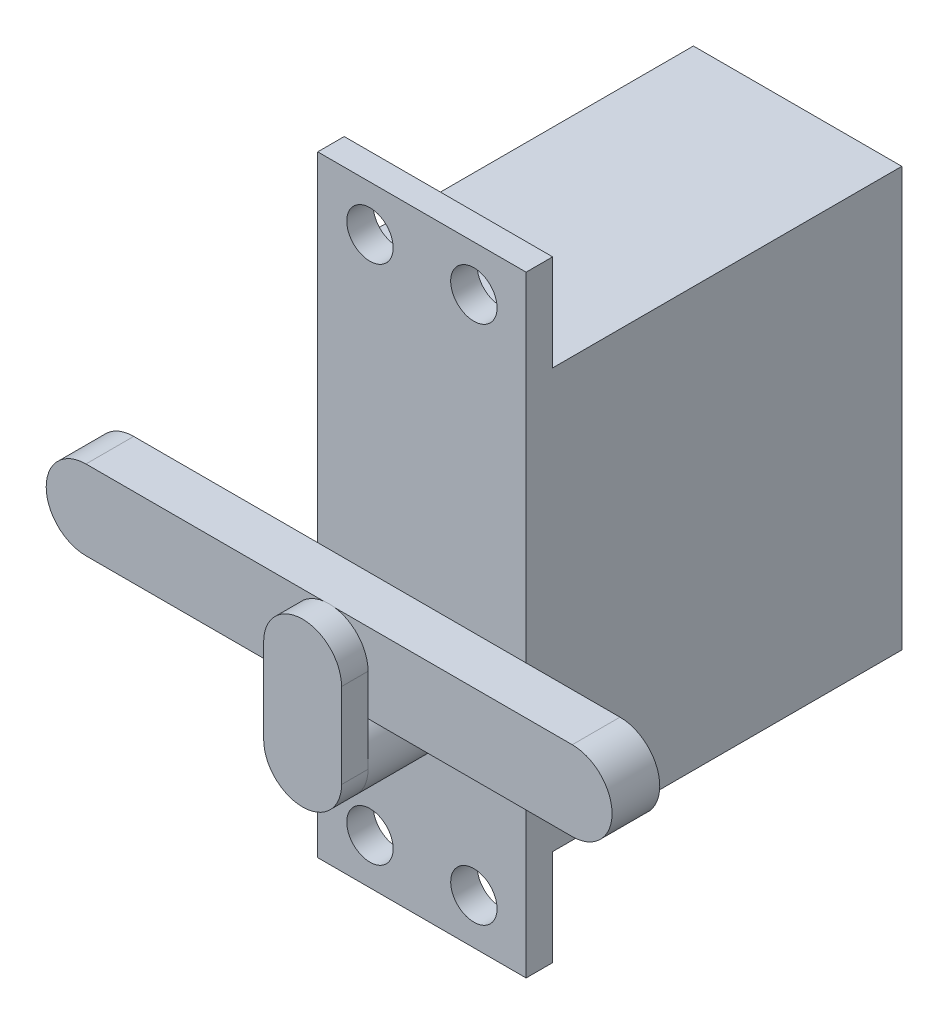
ISO-10303-21;
HEADER;
FILE_DESCRIPTION(('STEP AP214'),'2;1');
FILE_NAME('part.step','',(''),(''),'','','');
FILE_SCHEMA(('AUTOMOTIVE_DESIGN { 1 0 10303 214 1 1 1 1 }'));
ENDSEC;
DATA;
#1=APPLICATION_CONTEXT('core data for automotive mechanical design processes');
#2=APPLICATION_PROTOCOL_DEFINITION('international standard','automotive_design',2000,#1);
#3=PRODUCT_CONTEXT('',#1,'mechanical');
#4=PRODUCT('Part','Part','',(#3));
#5=PRODUCT_RELATED_PRODUCT_CATEGORY('part','',(#4));
#6=PRODUCT_DEFINITION_FORMATION('','',#4);
#7=PRODUCT_DEFINITION_CONTEXT('part definition',#1,'design');
#8=PRODUCT_DEFINITION('design','',#6,#7);
#9=PRODUCT_DEFINITION_SHAPE('','',#8);
#10=(LENGTH_UNIT() NAMED_UNIT(*) SI_UNIT(.MILLI.,.METRE.));
#11=(NAMED_UNIT(*) PLANE_ANGLE_UNIT() SI_UNIT($,.RADIAN.));
#12=(NAMED_UNIT(*) SI_UNIT($,.STERADIAN.) SOLID_ANGLE_UNIT());
#13=UNCERTAINTY_MEASURE_WITH_UNIT(LENGTH_MEASURE(1.E-05),#10,'distance_accuracy_value','');
#14=(GEOMETRIC_REPRESENTATION_CONTEXT(3) GLOBAL_UNCERTAINTY_ASSIGNED_CONTEXT((#13)) GLOBAL_UNIT_ASSIGNED_CONTEXT((#10,
#11,#12)) REPRESENTATION_CONTEXT('',''));
#15=CARTESIAN_POINT('',(0.,0.,0.));
#16=DIRECTION('',(0.,0.,1.));
#17=DIRECTION('',(1.,0.,0.));
#18=AXIS2_PLACEMENT_3D('',#15,#16,#17);
#19=CARTESIAN_POINT('',(0.,14.4241287550858,66.3463432179268));
#20=DIRECTION('',(0.,0.,-1.));
#21=DIRECTION('',(-1.,0.,0.));
#22=AXIS2_PLACEMENT_3D('',#19,#20,#21);
#23=CYLINDRICAL_SURFACE('',#22,3.73047673079755);
#24=CARTESIAN_POINT('',(0.,14.4241287550858,63.8063432179268));
#25=DIRECTION('',(0.,0.,1.));
#26=DIRECTION('',(1.,0.,0.));
#27=AXIS2_PLACEMENT_3D('',#24,#25,#26);
#28=CIRCLE('',#27,3.73047673079755);
#29=CARTESIAN_POINT('',(3.73047673079755,14.4241287550858,63.8063432179268));
#30=VERTEX_POINT('',#29);
#31=CARTESIAN_POINT('',(-3.73047673079755,14.4241287550858,63.8063432179268));
#32=VERTEX_POINT('',#31);
#33=EDGE_CURVE('E108',#30,#32,#28,.T.);
#34=ORIENTED_EDGE('',*,*,#33,.T.);
#35=DIRECTION('',(0.,0.,-1.));
#36=VECTOR('',#35,1.);
#37=CARTESIAN_POINT('',(-3.73047673079755,14.4241287550858,66.3463432179268));
#38=LINE('',#37,#36);
#39=CARTESIAN_POINT('',(-3.73047673079755,14.4241287550858,66.3463432179268));
#40=VERTEX_POINT('',#39);
#41=EDGE_CURVE('E12',#40,#32,#38,.T.);
#42=ORIENTED_EDGE('',*,*,#41,.F.);
#43=CARTESIAN_POINT('',(0.,14.4241287550858,66.3463432179268));
#44=DIRECTION('',(0.,0.,1.));
#45=DIRECTION('',(1.,0.,0.));
#46=AXIS2_PLACEMENT_3D('',#43,#44,#45);
#47=CIRCLE('',#46,3.73047673079755);
#48=CARTESIAN_POINT('',(3.73047673079755,14.4241287550858,66.3463432179268));
#49=VERTEX_POINT('',#48);
#50=EDGE_CURVE('E96',#49,#40,#47,.T.);
#51=ORIENTED_EDGE('',*,*,#50,.F.);
#52=DIRECTION('',(0.,0.,-1.));
#53=VECTOR('',#52,1.);
#54=CARTESIAN_POINT('',(3.73047673079755,14.4241287550858,66.3463432179268));
#55=LINE('',#54,#53);
#56=EDGE_CURVE('E104',#49,#30,#55,.T.);
#57=ORIENTED_EDGE('',*,*,#56,.T.);
#58=EDGE_LOOP('',(#34,#42,#51,#57));
#59=FACE_BOUND('',#58,.T.);
#60=ADVANCED_FACE('F45',(#59),#23,.T.);
#61=CARTESIAN_POINT('',(-3.73047673079755,14.4241287550858,66.3463432179268));
#62=DIRECTION('',(1.,0.,0.));
#63=DIRECTION('',(0.,1.,0.));
#64=AXIS2_PLACEMENT_3D('',#61,#62,#63);
#65=PLANE('',#64);
#66=DIRECTION('',(0.,-1.,0.));
#67=VECTOR('',#66,1.);
#68=CARTESIAN_POINT('',(-3.73047673079755,14.4241287550858,63.8063432179268));
#69=LINE('',#68,#67);
#70=CARTESIAN_POINT('',(-3.73047673079754,6.29368329163792,63.8063432179268));
#71=VERTEX_POINT('',#70);
#72=EDGE_CURVE('E100',#32,#71,#69,.T.);
#73=ORIENTED_EDGE('',*,*,#72,.T.);
#74=DIRECTION('',(0.,0.,-1.));
#75=VECTOR('',#74,1.);
#76=CARTESIAN_POINT('',(-3.73047673079754,6.29368329163792,66.3463432179268));
#77=LINE('',#76,#75);
#78=CARTESIAN_POINT('',(-3.73047673079754,6.29368329163792,66.3463432179268));
#79=VERTEX_POINT('',#78);
#80=EDGE_CURVE('E53',#79,#71,#77,.T.);
#81=ORIENTED_EDGE('',*,*,#80,.F.);
#82=DIRECTION('',(0.,-1.,0.));
#83=VECTOR('',#82,1.);
#84=CARTESIAN_POINT('',(-3.73047673079755,14.4241287550858,66.3463432179268));
#85=LINE('',#84,#83);
#86=EDGE_CURVE('E91',#40,#79,#85,.T.);
#87=ORIENTED_EDGE('',*,*,#86,.F.);
#88=ORIENTED_EDGE('',*,*,#41,.T.);
#89=EDGE_LOOP('',(#73,#81,#87,#88));
#90=FACE_BOUND('',#89,.T.);
#91=ADVANCED_FACE('F99',(#90),#65,.F.);
#92=CARTESIAN_POINT('',(0.,6.29368329163793,66.3463432179268));
#93=DIRECTION('',(0.,0.,-1.));
#94=DIRECTION('',(-1.,0.,0.));
#95=AXIS2_PLACEMENT_3D('',#92,#93,#94);
#96=CYLINDRICAL_SURFACE('',#95,3.73047673079754);
#97=CARTESIAN_POINT('',(0.,6.29368329163793,63.8063432179268));
#98=DIRECTION('',(0.,0.,1.));
#99=DIRECTION('',(1.,0.,0.));
#100=AXIS2_PLACEMENT_3D('',#97,#98,#99);
#101=CIRCLE('',#100,3.73047673079754);
#102=CARTESIAN_POINT('',(3.73047673079755,6.29368329163793,63.8063432179268));
#103=VERTEX_POINT('',#102);
#104=EDGE_CURVE('E78',#71,#103,#101,.T.);
#105=ORIENTED_EDGE('',*,*,#104,.T.);
#106=DIRECTION('',(0.,0.,-1.));
#107=VECTOR('',#106,1.);
#108=CARTESIAN_POINT('',(3.73047673079755,6.29368329163793,66.3463432179268));
#109=LINE('',#108,#107);
#110=CARTESIAN_POINT('',(3.73047673079755,6.29368329163793,66.3463432179268));
#111=VERTEX_POINT('',#110);
#112=EDGE_CURVE('E101',#111,#103,#109,.T.);
#113=ORIENTED_EDGE('',*,*,#112,.F.);
#114=CARTESIAN_POINT('',(0.,6.29368329163793,66.3463432179268));
#115=DIRECTION('',(0.,0.,1.));
#116=DIRECTION('',(1.,0.,0.));
#117=AXIS2_PLACEMENT_3D('',#114,#115,#116);
#118=CIRCLE('',#117,3.73047673079754);
#119=EDGE_CURVE('E94',#79,#111,#118,.T.);
#120=ORIENTED_EDGE('',*,*,#119,.F.);
#121=ORIENTED_EDGE('',*,*,#80,.T.);
#122=EDGE_LOOP('',(#105,#113,#120,#121));
#123=FACE_BOUND('',#122,.T.);
#124=ADVANCED_FACE('F102',(#123),#96,.T.);
#125=CARTESIAN_POINT('',(3.73047673079755,14.4241287550858,66.3463432179268));
#126=DIRECTION('',(-1.,0.,0.));
#127=DIRECTION('',(0.,-1.,0.));
#128=AXIS2_PLACEMENT_3D('',#125,#126,#127);
#129=PLANE('',#128);
#130=DIRECTION('',(0.,1.,0.));
#131=VECTOR('',#130,1.);
#132=CARTESIAN_POINT('',(3.73047673079755,14.4241287550858,63.8063432179268));
#133=LINE('',#132,#131);
#134=EDGE_CURVE('E84',#103,#30,#133,.T.);
#135=ORIENTED_EDGE('',*,*,#134,.T.);
#136=ORIENTED_EDGE('',*,*,#56,.F.);
#137=DIRECTION('',(0.,1.,0.));
#138=VECTOR('',#137,1.);
#139=CARTESIAN_POINT('',(3.73047673079755,14.4241287550858,66.3463432179268));
#140=LINE('',#139,#138);
#141=EDGE_CURVE('E61',#111,#49,#140,.T.);
#142=ORIENTED_EDGE('',*,*,#141,.F.);
#143=ORIENTED_EDGE('',*,*,#112,.T.);
#144=EDGE_LOOP('',(#135,#136,#142,#143));
#145=FACE_BOUND('',#144,.T.);
#146=ADVANCED_FACE('F115',(#145),#129,.F.);
#147=CARTESIAN_POINT('',(0.,14.4241287550858,66.3463432179268));
#148=DIRECTION('',(0.,0.,1.));
#149=DIRECTION('',(1.,0.,0.));
#150=AXIS2_PLACEMENT_3D('',#147,#148,#149);
#151=PLANE('',#150);
#152=ORIENTED_EDGE('',*,*,#50,.T.);
#153=ORIENTED_EDGE('',*,*,#86,.T.);
#154=ORIENTED_EDGE('',*,*,#119,.T.);
#155=ORIENTED_EDGE('',*,*,#141,.T.);
#156=EDGE_LOOP('',(#152,#153,#154,#155));
#157=FACE_BOUND('',#156,.T.);
#158=ADVANCED_FACE('F92',(#157),#151,.T.);
#159=CARTESIAN_POINT('',(0.,14.4241287550858,63.8063432179268));
#160=DIRECTION('',(0.,0.,1.));
#161=DIRECTION('',(1.,0.,0.));
#162=AXIS2_PLACEMENT_3D('',#159,#160,#161);
#163=PLANE('',#162);
#164=ORIENTED_EDGE('',*,*,#33,.F.);
#165=ORIENTED_EDGE('',*,*,#134,.F.);
#166=ORIENTED_EDGE('',*,*,#104,.F.);
#167=ORIENTED_EDGE('',*,*,#72,.F.);
#168=EDGE_LOOP('',(#164,#165,#166,#167));
#169=FACE_BOUND('',#168,.T.);
#170=ADVANCED_FACE('F118',(#169),#163,.F.);
#171=CLOSED_SHELL('',(#60,#91,#124,#146,#158,#170));
#172=MANIFOLD_SOLID_BREP('B2',#171);
#173=CARTESIAN_POINT('',(23.2931343343188,14.2993852114119,59.2343432179268));
#174=DIRECTION('',(0.,0.,1.));
#175=DIRECTION('',(1.,0.,0.));
#176=AXIS2_PLACEMENT_3D('',#173,#174,#175);
#177=CYLINDRICAL_SURFACE('',#176,3.81139952589896);
#178=CARTESIAN_POINT('',(23.2931343343188,14.2993852114119,63.8063432179268));
#179=DIRECTION('',(0.,0.,1.));
#180=DIRECTION('',(1.,0.,0.));
#181=AXIS2_PLACEMENT_3D('',#178,#179,#180);
#182=CIRCLE('',#181,3.81139952589896);
#183=CARTESIAN_POINT('',(23.2931343343188,10.4879856855129,63.8063432179268));
#184=VERTEX_POINT('',#183);
#185=CARTESIAN_POINT('',(23.2931343343188,18.1107847373108,63.8063432179268));
#186=VERTEX_POINT('',#185);
#187=EDGE_CURVE('E241',#184,#186,#182,.T.);
#188=ORIENTED_EDGE('',*,*,#187,.F.);
#189=DIRECTION('',(0.,0.,1.));
#190=VECTOR('',#189,1.);
#191=CARTESIAN_POINT('',(23.2931343343188,10.4879856855129,59.2343432179268));
#192=LINE('',#191,#190);
#193=CARTESIAN_POINT('',(23.2931343343188,10.4879856855129,59.2343432179268));
#194=VERTEX_POINT('',#193);
#195=EDGE_CURVE('E43',#194,#184,#192,.T.);
#196=ORIENTED_EDGE('',*,*,#195,.F.);
#197=CARTESIAN_POINT('',(23.2931343343188,14.2993852114119,59.2343432179268));
#198=DIRECTION('',(0.,0.,1.));
#199=DIRECTION('',(1.,0.,0.));
#200=AXIS2_PLACEMENT_3D('',#197,#198,#199);
#201=CIRCLE('',#200,3.81139952589896);
#202=CARTESIAN_POINT('',(23.2931343343188,18.1107847373108,59.2343432179268));
#203=VERTEX_POINT('',#202);
#204=EDGE_CURVE('E235',#194,#203,#201,.T.);
#205=ORIENTED_EDGE('',*,*,#204,.T.);
#206=DIRECTION('',(0.,0.,1.));
#207=VECTOR('',#206,1.);
#208=CARTESIAN_POINT('',(23.2931343343188,18.1107847373108,59.2343432179268));
#209=LINE('',#208,#207);
#210=EDGE_CURVE('E180',#203,#186,#209,.T.);
#211=ORIENTED_EDGE('',*,*,#210,.T.);
#212=EDGE_LOOP('',(#188,#196,#205,#211));
#213=FACE_BOUND('',#212,.T.);
#214=ADVANCED_FACE('F177',(#213),#177,.T.);
#215=CARTESIAN_POINT('',(23.2931343343188,10.4879856855129,59.2343432179268));
#216=DIRECTION('',(0.,-1.,0.));
#217=DIRECTION('',(0.,0.,-1.));
#218=AXIS2_PLACEMENT_3D('',#215,#216,#217);
#219=PLANE('',#218);
#220=DIRECTION('',(1.,0.,0.));
#221=VECTOR('',#220,1.);
#222=CARTESIAN_POINT('',(23.2931343343188,10.4879856855129,63.8063432179268));
#223=LINE('',#222,#221);
#224=CARTESIAN_POINT('',(-23.2931343343188,10.4879856855129,63.8063432179268));
#225=VERTEX_POINT('',#224);
#226=EDGE_CURVE('E237',#225,#184,#223,.T.);
#227=ORIENTED_EDGE('',*,*,#226,.F.);
#228=DIRECTION('',(0.,0.,1.));
#229=VECTOR('',#228,1.);
#230=CARTESIAN_POINT('',(-23.2931343343188,10.4879856855129,59.2343432179268));
#231=LINE('',#230,#229);
#232=CARTESIAN_POINT('',(-23.2931343343188,10.4879856855129,59.2343432179268));
#233=VERTEX_POINT('',#232);
#234=EDGE_CURVE('E186',#233,#225,#231,.T.);
#235=ORIENTED_EDGE('',*,*,#234,.F.);
#236=DIRECTION('',(1.,0.,0.));
#237=VECTOR('',#236,1.);
#238=CARTESIAN_POINT('',(23.2931343343188,10.4879856855129,59.2343432179268));
#239=LINE('',#238,#237);
#240=EDGE_CURVE('E232',#233,#194,#239,.T.);
#241=ORIENTED_EDGE('',*,*,#240,.T.);
#242=ORIENTED_EDGE('',*,*,#195,.T.);
#243=EDGE_LOOP('',(#227,#235,#241,#242));
#244=FACE_BOUND('',#243,.T.);
#245=ADVANCED_FACE('F251',(#244),#219,.T.);
#246=CARTESIAN_POINT('',(-23.2931343343188,14.2993852114119,59.2343432179268));
#247=DIRECTION('',(0.,0.,1.));
#248=DIRECTION('',(1.,0.,0.));
#249=AXIS2_PLACEMENT_3D('',#246,#247,#248);
#250=CYLINDRICAL_SURFACE('',#249,3.81139952589896);
#251=CARTESIAN_POINT('',(-23.2931343343188,14.2993852114119,63.8063432179268));
#252=DIRECTION('',(0.,0.,1.));
#253=DIRECTION('',(-1.,0.,0.));
#254=AXIS2_PLACEMENT_3D('',#251,#252,#253);
#255=CIRCLE('',#254,3.81139952589896);
#256=CARTESIAN_POINT('',(-23.2931343343188,18.1107847373108,63.8063432179268));
#257=VERTEX_POINT('',#256);
#258=EDGE_CURVE('E227',#257,#225,#255,.T.);
#259=ORIENTED_EDGE('',*,*,#258,.F.);
#260=DIRECTION('',(0.,0.,1.));
#261=VECTOR('',#260,1.);
#262=CARTESIAN_POINT('',(-23.2931343343188,18.1107847373108,59.2343432179268));
#263=LINE('',#262,#261);
#264=CARTESIAN_POINT('',(-23.2931343343188,18.1107847373108,59.2343432179268));
#265=VERTEX_POINT('',#264);
#266=EDGE_CURVE('E222',#265,#257,#263,.T.);
#267=ORIENTED_EDGE('',*,*,#266,.F.);
#268=CARTESIAN_POINT('',(-23.2931343343188,14.2993852114119,59.2343432179268));
#269=DIRECTION('',(0.,0.,1.));
#270=DIRECTION('',(-1.,0.,0.));
#271=AXIS2_PLACEMENT_3D('',#268,#269,#270);
#272=CIRCLE('',#271,3.81139952589896);
#273=EDGE_CURVE('E225',#265,#233,#272,.T.);
#274=ORIENTED_EDGE('',*,*,#273,.T.);
#275=ORIENTED_EDGE('',*,*,#234,.T.);
#276=EDGE_LOOP('',(#259,#267,#274,#275));
#277=FACE_BOUND('',#276,.T.);
#278=ADVANCED_FACE('F224',(#277),#250,.T.);
#279=CARTESIAN_POINT('',(23.2931343343188,18.1107847373108,59.2343432179268));
#280=DIRECTION('',(0.,1.,0.));
#281=DIRECTION('',(-1.,0.,0.));
#282=AXIS2_PLACEMENT_3D('',#279,#280,#281);
#283=PLANE('',#282);
#284=DIRECTION('',(-1.,0.,0.));
#285=VECTOR('',#284,1.);
#286=CARTESIAN_POINT('',(23.2931343343188,18.1107847373108,63.8063432179268));
#287=LINE('',#286,#285);
#288=EDGE_CURVE('E244',#186,#257,#287,.T.);
#289=ORIENTED_EDGE('',*,*,#288,.F.);
#290=ORIENTED_EDGE('',*,*,#210,.F.);
#291=DIRECTION('',(-1.,0.,0.));
#292=VECTOR('',#291,1.);
#293=CARTESIAN_POINT('',(23.2931343343188,18.1107847373108,59.2343432179268));
#294=LINE('',#293,#292);
#295=EDGE_CURVE('E231',#203,#265,#294,.T.);
#296=ORIENTED_EDGE('',*,*,#295,.T.);
#297=ORIENTED_EDGE('',*,*,#266,.T.);
#298=EDGE_LOOP('',(#289,#290,#296,#297));
#299=FACE_BOUND('',#298,.T.);
#300=ADVANCED_FACE('F234',(#299),#283,.T.);
#301=CARTESIAN_POINT('',(23.2931343343188,14.2993852114119,59.2343432179268));
#302=DIRECTION('',(0.,0.,1.));
#303=DIRECTION('',(1.,0.,0.));
#304=AXIS2_PLACEMENT_3D('',#301,#302,#303);
#305=PLANE('',#304);
#306=ORIENTED_EDGE('',*,*,#204,.F.);
#307=ORIENTED_EDGE('',*,*,#240,.F.);
#308=ORIENTED_EDGE('',*,*,#273,.F.);
#309=ORIENTED_EDGE('',*,*,#295,.F.);
#310=EDGE_LOOP('',(#306,#307,#308,#309));
#311=FACE_BOUND('',#310,.T.);
#312=ADVANCED_FACE('F230',(#311),#305,.F.);
#313=CARTESIAN_POINT('',(23.2931343343188,14.2993852114119,63.8063432179268));
#314=DIRECTION('',(0.,0.,1.));
#315=DIRECTION('',(1.,0.,0.));
#316=AXIS2_PLACEMENT_3D('',#313,#314,#315);
#317=PLANE('',#316);
#318=ORIENTED_EDGE('',*,*,#187,.T.);
#319=ORIENTED_EDGE('',*,*,#288,.T.);
#320=ORIENTED_EDGE('',*,*,#258,.T.);
#321=ORIENTED_EDGE('',*,*,#226,.T.);
#322=EDGE_LOOP('',(#318,#319,#320,#321));
#323=FACE_BOUND('',#322,.T.);
#324=ADVANCED_FACE('F250',(#323),#317,.T.);
#325=CLOSED_SHELL('',(#214,#245,#278,#300,#312,#324));
#326=MANIFOLD_SOLID_BREP('B6',#325);
#327=CARTESIAN_POINT('',(0.,6.29368329163793,63.8063432179268));
#328=DIRECTION('',(0.,0.,-1.));
#329=DIRECTION('',(-1.,0.,0.));
#330=AXIS2_PLACEMENT_3D('',#327,#328,#329);
#331=CYLINDRICAL_SURFACE('',#330,3.73047673079755);
#332=CARTESIAN_POINT('',(0.,6.29368329163793,63.8063432179268));
#333=DIRECTION('',(0.,0.,1.));
#334=DIRECTION('',(1.,0.,0.));
#335=AXIS2_PLACEMENT_3D('',#332,#333,#334);
#336=CIRCLE('',#335,3.73047673079755);
#337=CARTESIAN_POINT('',(3.73047673079755,6.29368329163793,63.8063432179268));
#338=VERTEX_POINT('',#337);
#339=EDGE_CURVE('E176',#338,#338,#336,.T.);
#340=ORIENTED_EDGE('',*,*,#339,.F.);
#341=EDGE_LOOP('',(#340));
#342=FACE_BOUND('',#341,.T.);
#343=CARTESIAN_POINT('',(0.,6.29368329163793,54.9163432179269));
#344=DIRECTION('',(0.,0.,1.));
#345=DIRECTION('',(1.,0.,0.));
#346=AXIS2_PLACEMENT_3D('',#343,#344,#345);
#347=CIRCLE('',#346,3.73047673079755);
#348=CARTESIAN_POINT('',(3.73047673079755,6.29368329163793,54.9163432179269));
#349=VERTEX_POINT('',#348);
#350=EDGE_CURVE('E312',#349,#349,#347,.T.);
#351=ORIENTED_EDGE('',*,*,#350,.T.);
#352=EDGE_LOOP('',(#351));
#353=FACE_BOUND('',#352,.T.);
#354=ADVANCED_FACE('F309',(#342,#353),#331,.T.);
#355=CARTESIAN_POINT('',(0.,6.29368329163793,63.8063432179268));
#356=DIRECTION('',(0.,0.,1.));
#357=DIRECTION('',(1.,0.,0.));
#358=AXIS2_PLACEMENT_3D('',#355,#356,#357);
#359=PLANE('',#358);
#360=ORIENTED_EDGE('',*,*,#339,.T.);
#361=EDGE_LOOP('',(#360));
#362=FACE_BOUND('',#361,.T.);
#363=ADVANCED_FACE('F324',(#362),#359,.T.);
#364=CARTESIAN_POINT('',(0.,6.29368329163793,54.9163432179269));
#365=DIRECTION('',(0.,0.,1.));
#366=DIRECTION('',(1.,0.,0.));
#367=AXIS2_PLACEMENT_3D('',#364,#365,#366);
#368=PLANE('',#367);
#369=ORIENTED_EDGE('',*,*,#350,.F.);
#370=EDGE_LOOP('',(#369));
#371=FACE_BOUND('',#370,.T.);
#372=ADVANCED_FACE('F322',(#371),#368,.F.);
#373=CLOSED_SHELL('',(#354,#363,#372));
#374=MANIFOLD_SOLID_BREP('B37',#373);
#375=CARTESIAN_POINT('',(9.9822,-3.12971670836207,54.9163432179269));
#376=DIRECTION('',(0.,1.,0.));
#377=DIRECTION('',(0.,0.,1.));
#378=AXIS2_PLACEMENT_3D('',#375,#376,#377);
#379=PLANE('',#378);
#380=DIRECTION('',(0.,0.,-1.));
#381=VECTOR('',#380,1.);
#382=CARTESIAN_POINT('',(9.9822,-3.12971670836207,54.9163432179269));
#383=LINE('',#382,#381);
#384=CARTESIAN_POINT('',(9.9822,-3.12971670836207,52.3763432179269));
#385=VERTEX_POINT('',#384);
#386=CARTESIAN_POINT('',(9.9822,-3.12971670836207,18.9245432179268));
#387=VERTEX_POINT('',#386);
#388=EDGE_CURVE('E446',#385,#387,#383,.T.);
#389=ORIENTED_EDGE('',*,*,#388,.F.);
#390=DIRECTION('',(-1.,0.,0.));
#391=VECTOR('',#390,1.);
#392=CARTESIAN_POINT('',(-9.9822,-3.12971670836207,52.3763432179269));
#393=LINE('',#392,#391);
#394=CARTESIAN_POINT('',(-9.9822,-3.12971670836207,52.3763432179269));
#395=VERTEX_POINT('',#394);
#396=EDGE_CURVE('E436',#385,#395,#393,.T.);
#397=ORIENTED_EDGE('',*,*,#396,.T.);
#398=DIRECTION('',(0.,0.,-1.));
#399=VECTOR('',#398,1.);
#400=CARTESIAN_POINT('',(-9.9822,-3.12971670836207,54.9163432179269));
#401=LINE('',#400,#399);
#402=CARTESIAN_POINT('',(-9.9822,-3.12971670836207,18.9245432179268));
#403=VERTEX_POINT('',#402);
#404=EDGE_CURVE('E435',#395,#403,#401,.T.);
#405=ORIENTED_EDGE('',*,*,#404,.T.);
#406=DIRECTION('',(-1.,0.,0.));
#407=VECTOR('',#406,1.);
#408=CARTESIAN_POINT('',(9.9822,-3.12971670836207,18.9245432179268));
#409=LINE('',#408,#407);
#410=EDGE_CURVE('E307',#387,#403,#409,.T.);
#411=ORIENTED_EDGE('',*,*,#410,.F.);
#412=EDGE_LOOP('',(#389,#397,#405,#411));
#413=FACE_BOUND('',#412,.T.);
#414=ADVANCED_FACE('F349',(#413),#379,.F.);
#415=CARTESIAN_POINT('',(9.9822,37.0022832916379,18.9245432179269));
#416=DIRECTION('',(0.,0.,1.));
#417=DIRECTION('',(0.,-1.,0.));
#418=AXIS2_PLACEMENT_3D('',#415,#416,#417);
#419=PLANE('',#418);
#420=DIRECTION('',(0.,1.,0.));
#421=VECTOR('',#420,1.);
#422=CARTESIAN_POINT('',(-9.9822,37.0022832916379,18.9245432179269));
#423=LINE('',#422,#421);
#424=CARTESIAN_POINT('',(-9.9822,37.0022832916379,18.9245432179269));
#425=VERTEX_POINT('',#424);
#426=EDGE_CURVE('E493',#403,#425,#423,.T.);
#427=ORIENTED_EDGE('',*,*,#426,.T.);
#428=DIRECTION('',(-1.,0.,0.));
#429=VECTOR('',#428,1.);
#430=CARTESIAN_POINT('',(9.9822,37.0022832916379,18.9245432179269));
#431=LINE('',#430,#429);
#432=CARTESIAN_POINT('',(9.9822,37.0022832916379,18.9245432179269));
#433=VERTEX_POINT('',#432);
#434=EDGE_CURVE('E357',#433,#425,#431,.T.);
#435=ORIENTED_EDGE('',*,*,#434,.F.);
#436=DIRECTION('',(0.,1.,0.));
#437=VECTOR('',#436,1.);
#438=CARTESIAN_POINT('',(9.9822,37.0022832916379,18.9245432179269));
#439=LINE('',#438,#437);
#440=EDGE_CURVE('E450',#387,#433,#439,.T.);
#441=ORIENTED_EDGE('',*,*,#440,.F.);
#442=ORIENTED_EDGE('',*,*,#410,.T.);
#443=EDGE_LOOP('',(#427,#435,#441,#442));
#444=FACE_BOUND('',#443,.T.);
#445=ADVANCED_FACE('F532',(#444),#419,.F.);
#446=CARTESIAN_POINT('',(9.9822,37.0022832916379,54.9163432179269));
#447=DIRECTION('',(0.,-1.,0.));
#448=DIRECTION('',(0.,0.,-1.));
#449=AXIS2_PLACEMENT_3D('',#446,#447,#448);
#450=PLANE('',#449);
#451=DIRECTION('',(0.,0.,1.));
#452=VECTOR('',#451,1.);
#453=CARTESIAN_POINT('',(-9.9822,37.0022832916379,54.9163432179269));
#454=LINE('',#453,#452);
#455=CARTESIAN_POINT('',(-9.9822,37.0022832916379,52.3763432179269));
#456=VERTEX_POINT('',#455);
#457=EDGE_CURVE('E454',#425,#456,#454,.T.);
#458=ORIENTED_EDGE('',*,*,#457,.T.);
#459=DIRECTION('',(1.,0.,0.));
#460=VECTOR('',#459,1.);
#461=CARTESIAN_POINT('',(-9.9822,37.0022832916379,52.3763432179269));
#462=LINE('',#461,#460);
#463=CARTESIAN_POINT('',(9.9822,37.0022832916379,52.3763432179269));
#464=VERTEX_POINT('',#463);
#465=EDGE_CURVE('E473',#456,#464,#462,.T.);
#466=ORIENTED_EDGE('',*,*,#465,.T.);
#467=DIRECTION('',(0.,0.,1.));
#468=VECTOR('',#467,1.);
#469=CARTESIAN_POINT('',(9.9822,37.0022832916379,54.9163432179269));
#470=LINE('',#469,#468);
#471=EDGE_CURVE('E452',#433,#464,#470,.T.);
#472=ORIENTED_EDGE('',*,*,#471,.F.);
#473=ORIENTED_EDGE('',*,*,#434,.T.);
#474=EDGE_LOOP('',(#458,#466,#472,#473));
#475=FACE_BOUND('',#474,.T.);
#476=ADVANCED_FACE('F510',(#475),#450,.F.);
#477=CARTESIAN_POINT('',(9.9822,-3.12971670836207,54.9163432179269));
#478=DIRECTION('',(0.,0.,-1.));
#479=DIRECTION('',(-1.,0.,0.));
#480=AXIS2_PLACEMENT_3D('',#477,#478,#479);
#481=PLANE('',#480);
#482=DIRECTION('',(0.,-1.,0.));
#483=VECTOR('',#482,1.);
#484=CARTESIAN_POINT('',(-9.9822,-3.12971670836207,54.9163432179269));
#485=LINE('',#484,#483);
#486=CARTESIAN_POINT('',(-9.9822,46.2176758972548,54.9163432179269));
#487=VERTEX_POINT('',#486);
#488=CARTESIAN_POINT('',(-9.9822,-12.3451093139789,54.9163432179269));
#489=VERTEX_POINT('',#488);
#490=EDGE_CURVE('E451',#487,#489,#485,.T.);
#491=ORIENTED_EDGE('',*,*,#490,.T.);
#492=DIRECTION('',(1.,0.,0.));
#493=VECTOR('',#492,1.);
#494=CARTESIAN_POINT('',(-9.9822,-12.3451093139789,54.9163432179269));
#495=LINE('',#494,#493);
#496=CARTESIAN_POINT('',(9.9822,-12.3451093139789,54.9163432179269));
#497=VERTEX_POINT('',#496);
#498=EDGE_CURVE('E424',#489,#497,#495,.T.);
#499=ORIENTED_EDGE('',*,*,#498,.T.);
#500=DIRECTION('',(0.,-1.,0.));
#501=VECTOR('',#500,1.);
#502=CARTESIAN_POINT('',(9.9822,-3.12971670836207,54.9163432179269));
#503=LINE('',#502,#501);
#504=CARTESIAN_POINT('',(9.9822,46.2176758972548,54.9163432179269));
#505=VERTEX_POINT('',#504);
#506=EDGE_CURVE('E467',#505,#497,#503,.T.);
#507=ORIENTED_EDGE('',*,*,#506,.F.);
#508=DIRECTION('',(-1.,0.,0.));
#509=VECTOR('',#508,1.);
#510=CARTESIAN_POINT('',(-9.9822,46.2176758972548,54.9163432179269));
#511=LINE('',#510,#509);
#512=EDGE_CURVE('E486',#505,#487,#511,.T.);
#513=ORIENTED_EDGE('',*,*,#512,.T.);
#514=EDGE_LOOP('',(#491,#499,#507,#513));
#515=FACE_BOUND('',#514,.T.);
#516=CARTESIAN_POINT('',(-4.9784,41.8645049195889,54.9163432179269));
#517=DIRECTION('',(0.,0.,1.));
#518=DIRECTION('',(1.,0.,0.));
#519=AXIS2_PLACEMENT_3D('',#516,#517,#518);
#520=CIRCLE('',#519,2.2225);
#521=CARTESIAN_POINT('',(-2.7559,41.8645049195889,54.9163432179269));
#522=VERTEX_POINT('',#521);
#523=EDGE_CURVE('E637',#522,#522,#520,.T.);
#524=ORIENTED_EDGE('',*,*,#523,.F.);
#525=EDGE_LOOP('',(#524));
#526=FACE_BOUND('',#525,.T.);
#527=CARTESIAN_POINT('',(4.9784,41.8645049195889,54.9163432179269));
#528=DIRECTION('',(0.,0.,1.));
#529=DIRECTION('',(1.,0.,0.));
#530=AXIS2_PLACEMENT_3D('',#527,#528,#529);
#531=CIRCLE('',#530,2.2225);
#532=CARTESIAN_POINT('',(7.2009,41.8645049195889,54.9163432179269));
#533=VERTEX_POINT('',#532);
#534=EDGE_CURVE('E481',#533,#533,#531,.T.);
#535=ORIENTED_EDGE('',*,*,#534,.F.);
#536=EDGE_LOOP('',(#535));
#537=FACE_BOUND('',#536,.T.);
#538=CARTESIAN_POINT('',(4.9784,-7.99193833631301,54.9163432179269));
#539=DIRECTION('',(0.,0.,1.));
#540=DIRECTION('',(-1.,0.,0.));
#541=AXIS2_PLACEMENT_3D('',#538,#539,#540);
#542=CIRCLE('',#541,2.2225);
#543=CARTESIAN_POINT('',(2.7559,-7.99193833631301,54.9163432179269));
#544=VERTEX_POINT('',#543);
#545=EDGE_CURVE('E624',#544,#544,#542,.T.);
#546=ORIENTED_EDGE('',*,*,#545,.F.);
#547=EDGE_LOOP('',(#546));
#548=FACE_BOUND('',#547,.T.);
#549=CARTESIAN_POINT('',(-4.9784,-7.99193833631301,54.9163432179269));
#550=DIRECTION('',(0.,0.,1.));
#551=DIRECTION('',(-1.,0.,0.));
#552=AXIS2_PLACEMENT_3D('',#549,#550,#551);
#553=CIRCLE('',#552,2.2225);
#554=CARTESIAN_POINT('',(-7.2009,-7.99193833631301,54.9163432179269));
#555=VERTEX_POINT('',#554);
#556=EDGE_CURVE('E627',#555,#555,#553,.T.);
#557=ORIENTED_EDGE('',*,*,#556,.F.);
#558=EDGE_LOOP('',(#557));
#559=FACE_BOUND('',#558,.T.);
#560=ADVANCED_FACE('F497',(#515,#526,#537,#548,#559),#481,.F.);
#561=CARTESIAN_POINT('',(9.9822,-3.12971670836207,18.9245432179268));
#562=DIRECTION('',(-1.,0.,0.));
#563=DIRECTION('',(0.,0.,1.));
#564=AXIS2_PLACEMENT_3D('',#561,#562,#563);
#565=PLANE('',#564);
#566=ORIENTED_EDGE('',*,*,#506,.T.);
#567=DIRECTION('',(0.,0.,1.));
#568=VECTOR('',#567,1.);
#569=CARTESIAN_POINT('',(9.9822,-12.3451093139789,52.3763432179269));
#570=LINE('',#569,#568);
#571=CARTESIAN_POINT('',(9.9822,-12.3451093139789,52.3763432179269));
#572=VERTEX_POINT('',#571);
#573=EDGE_CURVE('E426',#572,#497,#570,.T.);
#574=ORIENTED_EDGE('',*,*,#573,.F.);
#575=DIRECTION('',(0.,1.,0.));
#576=VECTOR('',#575,1.);
#577=CARTESIAN_POINT('',(9.9822,-3.12971670836207,52.3763432179269));
#578=LINE('',#577,#576);
#579=EDGE_CURVE('E427',#572,#385,#578,.T.);
#580=ORIENTED_EDGE('',*,*,#579,.T.);
#581=ORIENTED_EDGE('',*,*,#388,.T.);
#582=ORIENTED_EDGE('',*,*,#440,.T.);
#583=ORIENTED_EDGE('',*,*,#471,.T.);
#584=DIRECTION('',(0.,1.,0.));
#585=VECTOR('',#584,1.);
#586=CARTESIAN_POINT('',(9.9822,37.0022832916379,52.3763432179269));
#587=LINE('',#586,#585);
#588=CARTESIAN_POINT('',(9.9822,46.2176758972548,52.3763432179269));
#589=VERTEX_POINT('',#588);
#590=EDGE_CURVE('E373',#464,#589,#587,.T.);
#591=ORIENTED_EDGE('',*,*,#590,.T.);
#592=DIRECTION('',(0.,0.,1.));
#593=VECTOR('',#592,1.);
#594=CARTESIAN_POINT('',(9.9822,46.2176758972548,52.3763432179269));
#595=LINE('',#594,#593);
#596=EDGE_CURVE('E462',#589,#505,#595,.T.);
#597=ORIENTED_EDGE('',*,*,#596,.T.);
#598=EDGE_LOOP('',(#566,#574,#580,#581,#582,#583,#591,#597));
#599=FACE_BOUND('',#598,.T.);
#600=ADVANCED_FACE('F445',(#599),#565,.F.);
#601=CARTESIAN_POINT('',(-9.9822,-3.12971670836207,18.9245432179268));
#602=DIRECTION('',(-1.,0.,0.));
#603=DIRECTION('',(0.,0.,1.));
#604=AXIS2_PLACEMENT_3D('',#601,#602,#603);
#605=PLANE('',#604);
#606=ORIENTED_EDGE('',*,*,#404,.F.);
#607=DIRECTION('',(0.,-1.,0.));
#608=VECTOR('',#607,1.);
#609=CARTESIAN_POINT('',(-9.9822,-3.12971670836207,52.3763432179269));
#610=LINE('',#609,#608);
#611=CARTESIAN_POINT('',(-9.9822,-12.3451093139789,52.3763432179269));
#612=VERTEX_POINT('',#611);
#613=EDGE_CURVE('E365',#395,#612,#610,.T.);
#614=ORIENTED_EDGE('',*,*,#613,.T.);
#615=DIRECTION('',(0.,0.,1.));
#616=VECTOR('',#615,1.);
#617=CARTESIAN_POINT('',(-9.9822,-12.3451093139789,52.3763432179269));
#618=LINE('',#617,#616);
#619=EDGE_CURVE('E418',#612,#489,#618,.T.);
#620=ORIENTED_EDGE('',*,*,#619,.T.);
#621=ORIENTED_EDGE('',*,*,#490,.F.);
#622=DIRECTION('',(0.,0.,1.));
#623=VECTOR('',#622,1.);
#624=CARTESIAN_POINT('',(-9.9822,46.2176758972548,52.3763432179269));
#625=LINE('',#624,#623);
#626=CARTESIAN_POINT('',(-9.9822,46.2176758972548,52.3763432179269));
#627=VERTEX_POINT('',#626);
#628=EDGE_CURVE('E489',#627,#487,#625,.T.);
#629=ORIENTED_EDGE('',*,*,#628,.F.);
#630=DIRECTION('',(0.,-1.,0.));
#631=VECTOR('',#630,1.);
#632=CARTESIAN_POINT('',(-9.9822,37.0022832916379,52.3763432179269));
#633=LINE('',#632,#631);
#634=EDGE_CURVE('E476',#627,#456,#633,.T.);
#635=ORIENTED_EDGE('',*,*,#634,.T.);
#636=ORIENTED_EDGE('',*,*,#457,.F.);
#637=ORIENTED_EDGE('',*,*,#426,.F.);
#638=EDGE_LOOP('',(#606,#614,#620,#621,#629,#635,#636,#637));
#639=FACE_BOUND('',#638,.T.);
#640=ADVANCED_FACE('F433',(#639),#605,.T.);
#641=CARTESIAN_POINT('',(-9.9822,46.2176758972548,52.3763432179269));
#642=DIRECTION('',(0.,1.,0.));
#643=DIRECTION('',(0.,0.,1.));
#644=AXIS2_PLACEMENT_3D('',#641,#642,#643);
#645=PLANE('',#644);
#646=ORIENTED_EDGE('',*,*,#512,.F.);
#647=ORIENTED_EDGE('',*,*,#596,.F.);
#648=DIRECTION('',(-1.,0.,0.));
#649=VECTOR('',#648,1.);
#650=CARTESIAN_POINT('',(-9.9822,46.2176758972548,52.3763432179269));
#651=LINE('',#650,#649);
#652=EDGE_CURVE('E483',#589,#627,#651,.T.);
#653=ORIENTED_EDGE('',*,*,#652,.T.);
#654=ORIENTED_EDGE('',*,*,#628,.T.);
#655=EDGE_LOOP('',(#646,#647,#653,#654));
#656=FACE_BOUND('',#655,.T.);
#657=ADVANCED_FACE('F495',(#656),#645,.T.);
#658=CARTESIAN_POINT('',(-9.9822,46.2176758972548,52.3763432179269));
#659=DIRECTION('',(0.,0.,-1.));
#660=DIRECTION('',(-1.,0.,0.));
#661=AXIS2_PLACEMENT_3D('',#658,#659,#660);
#662=PLANE('',#661);
#663=CARTESIAN_POINT('',(-4.9784,41.8645049195889,52.3763432179269));
#664=DIRECTION('',(0.,0.,1.));
#665=DIRECTION('',(1.,0.,0.));
#666=AXIS2_PLACEMENT_3D('',#663,#664,#665);
#667=CIRCLE('',#666,2.2225);
#668=CARTESIAN_POINT('',(-2.7559,41.8645049195889,52.3763432179269));
#669=VERTEX_POINT('',#668);
#670=EDGE_CURVE('E639',#669,#669,#667,.T.);
#671=ORIENTED_EDGE('',*,*,#670,.T.);
#672=EDGE_LOOP('',(#671));
#673=FACE_BOUND('',#672,.T.);
#674=CARTESIAN_POINT('',(4.9784,41.8645049195889,52.3763432179269));
#675=DIRECTION('',(0.,0.,1.));
#676=DIRECTION('',(1.,0.,0.));
#677=AXIS2_PLACEMENT_3D('',#674,#675,#676);
#678=CIRCLE('',#677,2.2225);
#679=CARTESIAN_POINT('',(7.2009,41.8645049195889,52.3763432179269));
#680=VERTEX_POINT('',#679);
#681=EDGE_CURVE('E488',#680,#680,#678,.T.);
#682=ORIENTED_EDGE('',*,*,#681,.T.);
#683=EDGE_LOOP('',(#682));
#684=FACE_BOUND('',#683,.T.);
#685=ORIENTED_EDGE('',*,*,#634,.F.);
#686=ORIENTED_EDGE('',*,*,#652,.F.);
#687=ORIENTED_EDGE('',*,*,#590,.F.);
#688=ORIENTED_EDGE('',*,*,#465,.F.);
#689=EDGE_LOOP('',(#685,#686,#687,#688));
#690=FACE_BOUND('',#689,.T.);
#691=ADVANCED_FACE('F516',(#673,#684,#690),#662,.T.);
#692=CARTESIAN_POINT('',(4.9784,41.8645049195889,52.3763432179269));
#693=DIRECTION('',(0.,0.,1.));
#694=DIRECTION('',(1.,0.,0.));
#695=AXIS2_PLACEMENT_3D('',#692,#693,#694);
#696=CYLINDRICAL_SURFACE('',#695,2.2225);
#697=ORIENTED_EDGE('',*,*,#681,.F.);
#698=EDGE_LOOP('',(#697));
#699=FACE_BOUND('',#698,.T.);
#700=ORIENTED_EDGE('',*,*,#534,.T.);
#701=EDGE_LOOP('',(#700));
#702=FACE_BOUND('',#701,.T.);
#703=ADVANCED_FACE('F518',(#699,#702),#696,.F.);
#704=CARTESIAN_POINT('',(-4.9784,41.8645049195889,52.3763432179269));
#705=DIRECTION('',(0.,0.,1.));
#706=DIRECTION('',(1.,0.,0.));
#707=AXIS2_PLACEMENT_3D('',#704,#705,#706);
#708=CYLINDRICAL_SURFACE('',#707,2.2225);
#709=ORIENTED_EDGE('',*,*,#670,.F.);
#710=EDGE_LOOP('',(#709));
#711=FACE_BOUND('',#710,.T.);
#712=ORIENTED_EDGE('',*,*,#523,.T.);
#713=EDGE_LOOP('',(#712));
#714=FACE_BOUND('',#713,.T.);
#715=ADVANCED_FACE('F525',(#711,#714),#708,.F.);
#716=CARTESIAN_POINT('',(-9.9822,-12.3451093139789,52.3763432179269));
#717=DIRECTION('',(0.,-1.,0.));
#718=DIRECTION('',(0.,0.,-1.));
#719=AXIS2_PLACEMENT_3D('',#716,#717,#718);
#720=PLANE('',#719);
#721=ORIENTED_EDGE('',*,*,#498,.F.);
#722=ORIENTED_EDGE('',*,*,#619,.F.);
#723=DIRECTION('',(1.,0.,0.));
#724=VECTOR('',#723,1.);
#725=CARTESIAN_POINT('',(-9.9822,-12.3451093139789,52.3763432179269));
#726=LINE('',#725,#724);
#727=EDGE_CURVE('E421',#612,#572,#726,.T.);
#728=ORIENTED_EDGE('',*,*,#727,.T.);
#729=ORIENTED_EDGE('',*,*,#573,.T.);
#730=EDGE_LOOP('',(#721,#722,#728,#729));
#731=FACE_BOUND('',#730,.T.);
#732=ADVANCED_FACE('F419',(#731),#720,.T.);
#733=CARTESIAN_POINT('',(9.9822,-3.12971670836207,52.3763432179269));
#734=DIRECTION('',(0.,0.,-1.));
#735=DIRECTION('',(-1.,0.,0.));
#736=AXIS2_PLACEMENT_3D('',#733,#734,#735);
#737=PLANE('',#736);
#738=CARTESIAN_POINT('',(4.9784,-7.99193833631301,52.3763432179269));
#739=DIRECTION('',(0.,0.,1.));
#740=DIRECTION('',(-1.,0.,0.));
#741=AXIS2_PLACEMENT_3D('',#738,#739,#740);
#742=CIRCLE('',#741,2.2225);
#743=CARTESIAN_POINT('',(2.7559,-7.99193833631301,52.3763432179269));
#744=VERTEX_POINT('',#743);
#745=EDGE_CURVE('E621',#744,#744,#742,.T.);
#746=ORIENTED_EDGE('',*,*,#745,.T.);
#747=EDGE_LOOP('',(#746));
#748=FACE_BOUND('',#747,.T.);
#749=CARTESIAN_POINT('',(-4.9784,-7.99193833631301,52.3763432179269));
#750=DIRECTION('',(0.,0.,1.));
#751=DIRECTION('',(-1.,0.,0.));
#752=AXIS2_PLACEMENT_3D('',#749,#750,#751);
#753=CIRCLE('',#752,2.2225);
#754=CARTESIAN_POINT('',(-7.2009,-7.99193833631301,52.3763432179269));
#755=VERTEX_POINT('',#754);
#756=EDGE_CURVE('E630',#755,#755,#753,.T.);
#757=ORIENTED_EDGE('',*,*,#756,.T.);
#758=EDGE_LOOP('',(#757));
#759=FACE_BOUND('',#758,.T.);
#760=ORIENTED_EDGE('',*,*,#396,.F.);
#761=ORIENTED_EDGE('',*,*,#579,.F.);
#762=ORIENTED_EDGE('',*,*,#727,.F.);
#763=ORIENTED_EDGE('',*,*,#613,.F.);
#764=EDGE_LOOP('',(#760,#761,#762,#763));
#765=FACE_BOUND('',#764,.T.);
#766=ADVANCED_FACE('F429',(#748,#759,#765),#737,.T.);
#767=CARTESIAN_POINT('',(-4.9784,-7.99193833631301,52.3763432179269));
#768=DIRECTION('',(0.,0.,1.));
#769=DIRECTION('',(1.,0.,0.));
#770=AXIS2_PLACEMENT_3D('',#767,#768,#769);
#771=CYLINDRICAL_SURFACE('',#770,2.2225);
#772=ORIENTED_EDGE('',*,*,#756,.F.);
#773=EDGE_LOOP('',(#772));
#774=FACE_BOUND('',#773,.T.);
#775=ORIENTED_EDGE('',*,*,#556,.T.);
#776=EDGE_LOOP('',(#775));
#777=FACE_BOUND('',#776,.T.);
#778=ADVANCED_FACE('F594',(#774,#777),#771,.F.);
#779=CARTESIAN_POINT('',(4.9784,-7.99193833631301,52.3763432179269));
#780=DIRECTION('',(0.,0.,1.));
#781=DIRECTION('',(1.,0.,0.));
#782=AXIS2_PLACEMENT_3D('',#779,#780,#781);
#783=CYLINDRICAL_SURFACE('',#782,2.2225);
#784=ORIENTED_EDGE('',*,*,#745,.F.);
#785=EDGE_LOOP('',(#784));
#786=FACE_BOUND('',#785,.T.);
#787=ORIENTED_EDGE('',*,*,#545,.T.);
#788=EDGE_LOOP('',(#787));
#789=FACE_BOUND('',#788,.T.);
#790=ADVANCED_FACE('F604',(#786,#789),#783,.F.);
#791=CLOSED_SHELL('',(#414,#445,#476,#560,#600,#640,#657,#691,#703,#715,#732,#766,#778,#790));
#792=MANIFOLD_SOLID_BREP('B171',#791);
#793=ADVANCED_BREP_SHAPE_REPRESENTATION('',(#18,#172,#326,#374,#792),#14);
#794=SHAPE_DEFINITION_REPRESENTATION(#9,#793);
ENDSEC;
END-ISO-10303-21;
